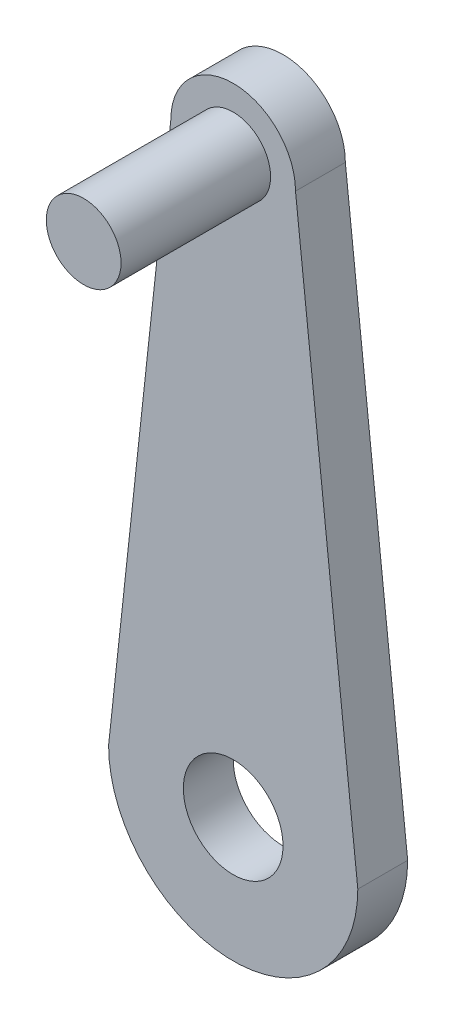
ISO-10303-21;
HEADER;
FILE_DESCRIPTION(('STEP AP214'),'2;1');
FILE_NAME('part.step','',(''),(''),'','','');
FILE_SCHEMA(('AUTOMOTIVE_DESIGN { 1 0 10303 214 1 1 1 1 }'));
ENDSEC;
DATA;
#1=APPLICATION_CONTEXT('core data for automotive mechanical design processes');
#2=APPLICATION_PROTOCOL_DEFINITION('international standard','automotive_design',2000,#1);
#3=PRODUCT_CONTEXT('',#1,'mechanical');
#4=PRODUCT('Part','Part','',(#3));
#5=PRODUCT_RELATED_PRODUCT_CATEGORY('part','',(#4));
#6=PRODUCT_DEFINITION_FORMATION('','',#4);
#7=PRODUCT_DEFINITION_CONTEXT('part definition',#1,'design');
#8=PRODUCT_DEFINITION('design','',#6,#7);
#9=PRODUCT_DEFINITION_SHAPE('','',#8);
#10=(LENGTH_UNIT() NAMED_UNIT(*) SI_UNIT(.MILLI.,.METRE.));
#11=(NAMED_UNIT(*) PLANE_ANGLE_UNIT() SI_UNIT($,.RADIAN.));
#12=(NAMED_UNIT(*) SI_UNIT($,.STERADIAN.) SOLID_ANGLE_UNIT());
#13=UNCERTAINTY_MEASURE_WITH_UNIT(LENGTH_MEASURE(1.E-05),#10,'distance_accuracy_value','');
#14=(GEOMETRIC_REPRESENTATION_CONTEXT(3) GLOBAL_UNCERTAINTY_ASSIGNED_CONTEXT((#13)) GLOBAL_UNIT_ASSIGNED_CONTEXT((#10,
#11,#12)) REPRESENTATION_CONTEXT('',''));
#15=CARTESIAN_POINT('',(0.,0.,0.));
#16=DIRECTION('',(0.,0.,1.));
#17=DIRECTION('',(1.,0.,0.));
#18=AXIS2_PLACEMENT_3D('',#15,#16,#17);
#19=CARTESIAN_POINT('',(4.94161606725829,0.537132181223727,2.));
#20=DIRECTION('',(-0.994144463069457,-0.108059180768419,0.));
#21=DIRECTION('',(0.108059180768419,-0.994144463069457,0.));
#22=AXIS2_PLACEMENT_3D('',#19,#20,#21);
#23=PLANE('',#22);
#24=DIRECTION('',(-0.108059180768419,0.994144463069457,0.));
#25=VECTOR('',#24,1.);
#26=CARTESIAN_POINT('',(4.94161606725829,0.537132181223727,0.));
#27=LINE('',#26,#25);
#28=CARTESIAN_POINT('',(5.,0.,0.));
#29=VERTEX_POINT('',#28);
#30=CARTESIAN_POINT('',(2.5,23.,0.));
#31=VERTEX_POINT('',#30);
#32=EDGE_CURVE('E99',#29,#31,#27,.T.);
#33=ORIENTED_EDGE('',*,*,#32,.T.);
#34=DIRECTION('',(0.,0.,-1.));
#35=VECTOR('',#34,1.);
#36=CARTESIAN_POINT('',(2.5,23.,2.));
#37=LINE('',#36,#35);
#38=CARTESIAN_POINT('',(2.5,23.,2.));
#39=VERTEX_POINT('',#38);
#40=EDGE_CURVE('E11',#39,#31,#37,.T.);
#41=ORIENTED_EDGE('',*,*,#40,.F.);
#42=DIRECTION('',(-0.108059180768419,0.994144463069457,0.));
#43=VECTOR('',#42,1.);
#44=CARTESIAN_POINT('',(4.94161606725829,0.537132181223727,2.));
#45=LINE('',#44,#43);
#46=CARTESIAN_POINT('',(5.,0.,2.));
#47=VERTEX_POINT('',#46);
#48=EDGE_CURVE('E83',#47,#39,#45,.T.);
#49=ORIENTED_EDGE('',*,*,#48,.F.);
#50=DIRECTION('',(0.,0.,-1.));
#51=VECTOR('',#50,1.);
#52=CARTESIAN_POINT('',(5.,0.,2.));
#53=LINE('',#52,#51);
#54=EDGE_CURVE('E95',#47,#29,#53,.T.);
#55=ORIENTED_EDGE('',*,*,#54,.T.);
#56=EDGE_LOOP('',(#33,#41,#49,#55));
#57=FACE_BOUND('',#56,.T.);
#58=ADVANCED_FACE('F35',(#57),#23,.F.);
#59=CARTESIAN_POINT('',(0.,23.,2.));
#60=DIRECTION('',(0.,0.,-1.));
#61=DIRECTION('',(-1.,0.,0.));
#62=AXIS2_PLACEMENT_3D('',#59,#60,#61);
#63=CYLINDRICAL_SURFACE('',#62,2.5);
#64=CARTESIAN_POINT('',(0.,23.,0.));
#65=DIRECTION('',(0.,0.,1.));
#66=DIRECTION('',(1.,0.,0.));
#67=AXIS2_PLACEMENT_3D('',#64,#65,#66);
#68=CIRCLE('',#67,2.5);
#69=CARTESIAN_POINT('',(-2.5,23.,0.));
#70=VERTEX_POINT('',#69);
#71=EDGE_CURVE('E88',#31,#70,#68,.T.);
#72=ORIENTED_EDGE('',*,*,#71,.T.);
#73=DIRECTION('',(0.,0.,-1.));
#74=VECTOR('',#73,1.);
#75=CARTESIAN_POINT('',(-2.5,23.,2.));
#76=LINE('',#75,#74);
#77=CARTESIAN_POINT('',(-2.5,23.,2.));
#78=VERTEX_POINT('',#77);
#79=EDGE_CURVE('E44',#78,#70,#76,.T.);
#80=ORIENTED_EDGE('',*,*,#79,.F.);
#81=CARTESIAN_POINT('',(0.,23.,2.));
#82=DIRECTION('',(0.,0.,1.));
#83=DIRECTION('',(1.,0.,0.));
#84=AXIS2_PLACEMENT_3D('',#81,#82,#83);
#85=CIRCLE('',#84,2.5);
#86=EDGE_CURVE('E78',#39,#78,#85,.T.);
#87=ORIENTED_EDGE('',*,*,#86,.F.);
#88=ORIENTED_EDGE('',*,*,#40,.T.);
#89=EDGE_LOOP('',(#72,#80,#87,#88));
#90=FACE_BOUND('',#89,.T.);
#91=ADVANCED_FACE('F87',(#90),#63,.T.);
#92=CARTESIAN_POINT('',(-4.94161606725829,0.537132181223727,2.));
#93=DIRECTION('',(-0.994144463069457,0.108059180768419,0.));
#94=DIRECTION('',(-0.108059180768419,-0.994144463069457,0.));
#95=AXIS2_PLACEMENT_3D('',#92,#93,#94);
#96=PLANE('',#95);
#97=DIRECTION('',(0.108059180768419,0.994144463069457,0.));
#98=VECTOR('',#97,1.);
#99=CARTESIAN_POINT('',(-4.94161606725829,0.537132181223727,0.));
#100=LINE('',#99,#98);
#101=CARTESIAN_POINT('',(-5.,0.,0.));
#102=VERTEX_POINT('',#101);
#103=EDGE_CURVE('E104',#102,#70,#100,.T.);
#104=ORIENTED_EDGE('',*,*,#103,.F.);
#105=DIRECTION('',(0.,0.,-1.));
#106=VECTOR('',#105,1.);
#107=CARTESIAN_POINT('',(-5.,0.,2.));
#108=LINE('',#107,#106);
#109=CARTESIAN_POINT('',(-5.,0.,2.));
#110=VERTEX_POINT('',#109);
#111=EDGE_CURVE('E68',#110,#102,#108,.T.);
#112=ORIENTED_EDGE('',*,*,#111,.F.);
#113=DIRECTION('',(0.108059180768419,0.994144463069457,0.));
#114=VECTOR('',#113,1.);
#115=CARTESIAN_POINT('',(-4.94161606725829,0.537132181223727,2.));
#116=LINE('',#115,#114);
#117=EDGE_CURVE('E81',#110,#78,#116,.T.);
#118=ORIENTED_EDGE('',*,*,#117,.T.);
#119=ORIENTED_EDGE('',*,*,#79,.T.);
#120=EDGE_LOOP('',(#104,#112,#118,#119));
#121=FACE_BOUND('',#120,.T.);
#122=ADVANCED_FACE('F93',(#121),#96,.T.);
#123=CARTESIAN_POINT('',(0.,0.,2.));
#124=DIRECTION('',(0.,0.,-1.));
#125=DIRECTION('',(-1.,0.,0.));
#126=AXIS2_PLACEMENT_3D('',#123,#124,#125);
#127=CYLINDRICAL_SURFACE('',#126,5.);
#128=CARTESIAN_POINT('',(0.,0.,0.));
#129=DIRECTION('',(0.,0.,1.));
#130=DIRECTION('',(1.,0.,0.));
#131=AXIS2_PLACEMENT_3D('',#128,#129,#130);
#132=CIRCLE('',#131,5.);
#133=EDGE_CURVE('E71',#102,#29,#132,.T.);
#134=ORIENTED_EDGE('',*,*,#133,.T.);
#135=ORIENTED_EDGE('',*,*,#54,.F.);
#136=CARTESIAN_POINT('',(0.,0.,2.));
#137=DIRECTION('',(0.,0.,1.));
#138=DIRECTION('',(1.,0.,0.));
#139=AXIS2_PLACEMENT_3D('',#136,#137,#138);
#140=CIRCLE('',#139,5.);
#141=EDGE_CURVE('E52',#110,#47,#140,.T.);
#142=ORIENTED_EDGE('',*,*,#141,.F.);
#143=ORIENTED_EDGE('',*,*,#111,.T.);
#144=EDGE_LOOP('',(#134,#135,#142,#143));
#145=FACE_BOUND('',#144,.T.);
#146=ADVANCED_FACE('F124',(#145),#127,.T.);
#147=CARTESIAN_POINT('',(0.,0.,2.));
#148=DIRECTION('',(0.,0.,1.));
#149=DIRECTION('',(1.,0.,0.));
#150=AXIS2_PLACEMENT_3D('',#147,#148,#149);
#151=PLANE('',#150);
#152=CARTESIAN_POINT('',(0.,0.,2.));
#153=DIRECTION('',(0.,0.,1.));
#154=DIRECTION('',(1.,0.,0.));
#155=AXIS2_PLACEMENT_3D('',#152,#153,#154);
#156=CIRCLE('',#155,2.);
#157=CARTESIAN_POINT('',(2.,0.,2.));
#158=VERTEX_POINT('',#157);
#159=EDGE_CURVE('E184',#158,#158,#156,.T.);
#160=ORIENTED_EDGE('',*,*,#159,.F.);
#161=EDGE_LOOP('',(#160));
#162=FACE_BOUND('',#161,.T.);
#163=CARTESIAN_POINT('',(0.,23.,2.));
#164=DIRECTION('',(0.,0.,1.));
#165=DIRECTION('',(1.,0.,0.));
#166=AXIS2_PLACEMENT_3D('',#163,#164,#165);
#167=CIRCLE('',#166,1.5);
#168=CARTESIAN_POINT('',(1.5,23.,2.));
#169=VERTEX_POINT('',#168);
#170=EDGE_CURVE('E107',#169,#169,#167,.T.);
#171=ORIENTED_EDGE('',*,*,#170,.F.);
#172=EDGE_LOOP('',(#171));
#173=FACE_BOUND('',#172,.T.);
#174=ORIENTED_EDGE('',*,*,#48,.T.);
#175=ORIENTED_EDGE('',*,*,#86,.T.);
#176=ORIENTED_EDGE('',*,*,#117,.F.);
#177=ORIENTED_EDGE('',*,*,#141,.T.);
#178=EDGE_LOOP('',(#174,#175,#176,#177));
#179=FACE_BOUND('',#178,.T.);
#180=ADVANCED_FACE('F79',(#162,#173,#179),#151,.T.);
#181=CARTESIAN_POINT('',(0.,0.,0.));
#182=DIRECTION('',(0.,0.,1.));
#183=DIRECTION('',(1.,0.,0.));
#184=AXIS2_PLACEMENT_3D('',#181,#182,#183);
#185=PLANE('',#184);
#186=CARTESIAN_POINT('',(0.,0.,0.));
#187=DIRECTION('',(0.,0.,1.));
#188=DIRECTION('',(1.,0.,0.));
#189=AXIS2_PLACEMENT_3D('',#186,#187,#188);
#190=CIRCLE('',#189,2.);
#191=CARTESIAN_POINT('',(2.,0.,0.));
#192=VERTEX_POINT('',#191);
#193=EDGE_CURVE('E38',#192,#192,#190,.T.);
#194=ORIENTED_EDGE('',*,*,#193,.T.);
#195=EDGE_LOOP('',(#194));
#196=FACE_BOUND('',#195,.T.);
#197=ORIENTED_EDGE('',*,*,#32,.F.);
#198=ORIENTED_EDGE('',*,*,#133,.F.);
#199=ORIENTED_EDGE('',*,*,#103,.T.);
#200=ORIENTED_EDGE('',*,*,#71,.F.);
#201=EDGE_LOOP('',(#197,#198,#199,#200));
#202=FACE_BOUND('',#201,.T.);
#203=ADVANCED_FACE('F112',(#196,#202),#185,.F.);
#204=CARTESIAN_POINT('',(0.,23.,8.));
#205=DIRECTION('',(0.,0.,-1.));
#206=DIRECTION('',(-1.,0.,0.));
#207=AXIS2_PLACEMENT_3D('',#204,#205,#206);
#208=CYLINDRICAL_SURFACE('',#207,1.5);
#209=ORIENTED_EDGE('',*,*,#170,.T.);
#210=EDGE_LOOP('',(#209));
#211=FACE_BOUND('',#210,.T.);
#212=CARTESIAN_POINT('',(0.,23.,8.));
#213=DIRECTION('',(0.,0.,1.));
#214=DIRECTION('',(1.,0.,0.));
#215=AXIS2_PLACEMENT_3D('',#212,#213,#214);
#216=CIRCLE('',#215,1.5);
#217=CARTESIAN_POINT('',(1.5,23.,8.));
#218=VERTEX_POINT('',#217);
#219=EDGE_CURVE('E102',#218,#218,#216,.T.);
#220=ORIENTED_EDGE('',*,*,#219,.F.);
#221=EDGE_LOOP('',(#220));
#222=FACE_BOUND('',#221,.T.);
#223=ADVANCED_FACE('F114',(#211,#222),#208,.T.);
#224=CARTESIAN_POINT('',(0.,23.,8.));
#225=DIRECTION('',(0.,0.,1.));
#226=DIRECTION('',(1.,0.,0.));
#227=AXIS2_PLACEMENT_3D('',#224,#225,#226);
#228=PLANE('',#227);
#229=ORIENTED_EDGE('',*,*,#219,.T.);
#230=EDGE_LOOP('',(#229));
#231=FACE_BOUND('',#230,.T.);
#232=ADVANCED_FACE('F121',(#231),#228,.T.);
#233=CARTESIAN_POINT('',(0.,0.,-8.));
#234=DIRECTION('',(0.,0.,1.));
#235=DIRECTION('',(1.,0.,0.));
#236=AXIS2_PLACEMENT_3D('',#233,#234,#235);
#237=CYLINDRICAL_SURFACE('',#236,2.);
#238=ORIENTED_EDGE('',*,*,#159,.T.);
#239=EDGE_LOOP('',(#238));
#240=FACE_BOUND('',#239,.T.);
#241=ORIENTED_EDGE('',*,*,#193,.F.);
#242=EDGE_LOOP('',(#241));
#243=FACE_BOUND('',#242,.T.);
#244=ADVANCED_FACE('F162',(#240,#243),#237,.F.);
#245=CLOSED_SHELL('',(#58,#91,#122,#146,#180,#203,#223,#232,#244));
#246=MANIFOLD_SOLID_BREP('B2',#245);
#247=ADVANCED_BREP_SHAPE_REPRESENTATION('',(#18,#246),#14);
#248=SHAPE_DEFINITION_REPRESENTATION(#9,#247);
ENDSEC;
END-ISO-10303-21;
